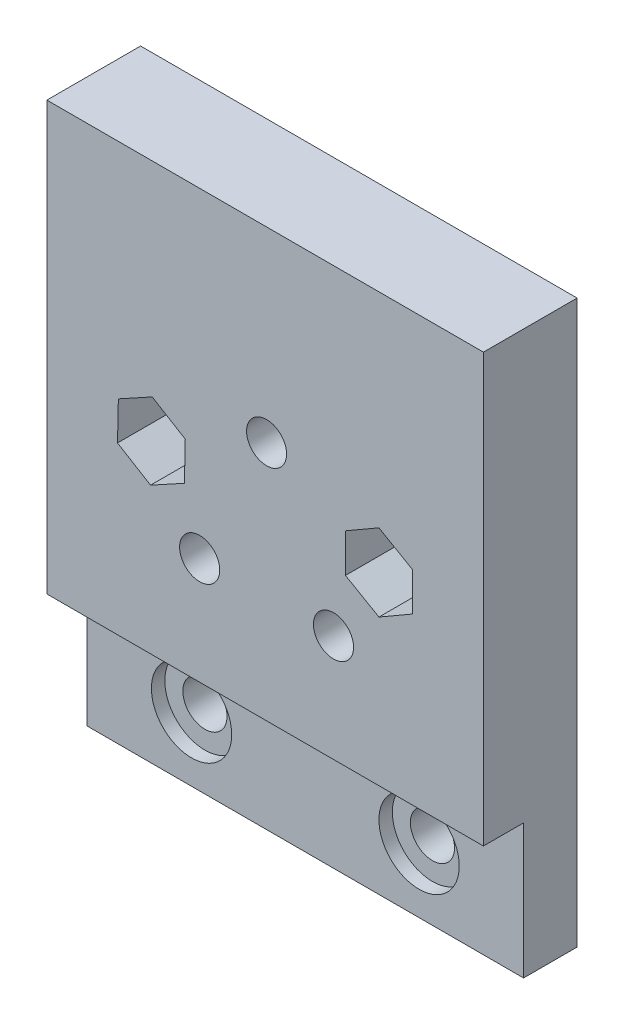
ISO-10303-21;
HEADER;
FILE_DESCRIPTION(('STEP AP214'),'2;1');
FILE_NAME('part.step','',(''),(''),'','','');
FILE_SCHEMA(('AUTOMOTIVE_DESIGN { 1 0 10303 214 1 1 1 1 }'));
ENDSEC;
DATA;
#1=APPLICATION_CONTEXT('core data for automotive mechanical design processes');
#2=APPLICATION_PROTOCOL_DEFINITION('international standard','automotive_design',2000,#1);
#3=PRODUCT_CONTEXT('',#1,'mechanical');
#4=PRODUCT('Part','Part','',(#3));
#5=PRODUCT_RELATED_PRODUCT_CATEGORY('part','',(#4));
#6=PRODUCT_DEFINITION_FORMATION('','',#4);
#7=PRODUCT_DEFINITION_CONTEXT('part definition',#1,'design');
#8=PRODUCT_DEFINITION('design','',#6,#7);
#9=PRODUCT_DEFINITION_SHAPE('','',#8);
#10=(LENGTH_UNIT() NAMED_UNIT(*) SI_UNIT(.MILLI.,.METRE.));
#11=(NAMED_UNIT(*) PLANE_ANGLE_UNIT() SI_UNIT($,.RADIAN.));
#12=(NAMED_UNIT(*) SI_UNIT($,.STERADIAN.) SOLID_ANGLE_UNIT());
#13=UNCERTAINTY_MEASURE_WITH_UNIT(LENGTH_MEASURE(1.E-05),#10,'distance_accuracy_value','');
#14=(GEOMETRIC_REPRESENTATION_CONTEXT(3) GLOBAL_UNCERTAINTY_ASSIGNED_CONTEXT((#13)) GLOBAL_UNIT_ASSIGNED_CONTEXT((#10,
#11,#12)) REPRESENTATION_CONTEXT('',''));
#15=CARTESIAN_POINT('',(0.,0.,0.));
#16=DIRECTION('',(0.,0.,1.));
#17=DIRECTION('',(1.,0.,0.));
#18=AXIS2_PLACEMENT_3D('',#15,#16,#17);
#19=CARTESIAN_POINT('',(0.107090409100055,13.7016999955428,-4.24264068711929));
#20=DIRECTION('',(0.,0.,1.));
#21=DIRECTION('',(1.,0.,0.));
#22=AXIS2_PLACEMENT_3D('',#19,#20,#21);
#23=CYLINDRICAL_SURFACE('',#22,1.49545472646863);
#24=CARTESIAN_POINT('',(0.107090409100055,13.7016999955428,7.));
#25=DIRECTION('',(0.,0.,1.));
#26=DIRECTION('',(1.,0.,0.));
#27=AXIS2_PLACEMENT_3D('',#24,#25,#26);
#28=CIRCLE('',#27,1.49545472646863);
#29=CARTESIAN_POINT('',(1.60254513556868,13.7016999955428,7.));
#30=VERTEX_POINT('',#29);
#31=EDGE_CURVE('E248',#30,#30,#28,.T.);
#32=ORIENTED_EDGE('',*,*,#31,.T.);
#33=EDGE_LOOP('',(#32));
#34=FACE_BOUND('',#33,.T.);
#35=CARTESIAN_POINT('',(0.107090409100055,13.7016999955428,4.));
#36=DIRECTION('',(0.,0.,-1.));
#37=DIRECTION('',(-1.,0.,0.));
#38=AXIS2_PLACEMENT_3D('',#35,#36,#37);
#39=CIRCLE('',#38,1.49545472646863);
#40=CARTESIAN_POINT('',(-1.38836431736857,13.7016999955428,4.));
#41=VERTEX_POINT('',#40);
#42=EDGE_CURVE('E37',#41,#41,#39,.F.);
#43=ORIENTED_EDGE('',*,*,#42,.F.);
#44=EDGE_LOOP('',(#43));
#45=FACE_BOUND('',#44,.T.);
#46=ADVANCED_FACE('F33',(#34,#45),#23,.F.);
#47=CARTESIAN_POINT('',(-4.89290959089994,3.70169999554279,-4.24264068711929));
#48=DIRECTION('',(0.,0.,1.));
#49=DIRECTION('',(1.,0.,0.));
#50=AXIS2_PLACEMENT_3D('',#47,#48,#49);
#51=CYLINDRICAL_SURFACE('',#50,1.5);
#52=CARTESIAN_POINT('',(-4.89290959089994,3.70169999554279,7.));
#53=DIRECTION('',(0.,0.,1.));
#54=DIRECTION('',(1.,0.,0.));
#55=AXIS2_PLACEMENT_3D('',#52,#53,#54);
#56=CIRCLE('',#55,1.5);
#57=CARTESIAN_POINT('',(-3.39290959089994,3.70169999554279,7.));
#58=VERTEX_POINT('',#57);
#59=EDGE_CURVE('E252',#58,#58,#56,.T.);
#60=ORIENTED_EDGE('',*,*,#59,.T.);
#61=EDGE_LOOP('',(#60));
#62=FACE_BOUND('',#61,.T.);
#63=CARTESIAN_POINT('',(-4.89290959089994,3.70169999554279,4.));
#64=DIRECTION('',(0.,0.,-1.));
#65=DIRECTION('',(-1.,0.,0.));
#66=AXIS2_PLACEMENT_3D('',#63,#64,#65);
#67=CIRCLE('',#66,1.5);
#68=CARTESIAN_POINT('',(-6.39290959089994,3.70169999554279,4.));
#69=VERTEX_POINT('',#68);
#70=EDGE_CURVE('E242',#69,#69,#67,.F.);
#71=ORIENTED_EDGE('',*,*,#70,.F.);
#72=EDGE_LOOP('',(#71));
#73=FACE_BOUND('',#72,.T.);
#74=ADVANCED_FACE('F399',(#62,#73),#51,.F.);
#75=CARTESIAN_POINT('',(5.10709040910006,3.70169999554279,-4.24264068711929));
#76=DIRECTION('',(0.,0.,1.));
#77=DIRECTION('',(1.,0.,0.));
#78=AXIS2_PLACEMENT_3D('',#75,#76,#77);
#79=CYLINDRICAL_SURFACE('',#78,1.5);
#80=CARTESIAN_POINT('',(5.10709040910006,3.70169999554279,7.));
#81=DIRECTION('',(0.,0.,1.));
#82=DIRECTION('',(1.,0.,0.));
#83=AXIS2_PLACEMENT_3D('',#80,#81,#82);
#84=CIRCLE('',#83,1.5);
#85=CARTESIAN_POINT('',(6.60709040910006,3.70169999554279,7.));
#86=VERTEX_POINT('',#85);
#87=EDGE_CURVE('E257',#86,#86,#84,.T.);
#88=ORIENTED_EDGE('',*,*,#87,.T.);
#89=EDGE_LOOP('',(#88));
#90=FACE_BOUND('',#89,.T.);
#91=CARTESIAN_POINT('',(5.10709040910006,3.70169999554279,4.));
#92=DIRECTION('',(0.,0.,-1.));
#93=DIRECTION('',(-1.,0.,0.));
#94=AXIS2_PLACEMENT_3D('',#91,#92,#93);
#95=CIRCLE('',#94,1.5);
#96=CARTESIAN_POINT('',(3.60709040910006,3.70169999554279,4.));
#97=VERTEX_POINT('',#96);
#98=EDGE_CURVE('E240',#97,#97,#95,.F.);
#99=ORIENTED_EDGE('',*,*,#98,.F.);
#100=EDGE_LOOP('',(#99));
#101=FACE_BOUND('',#100,.T.);
#102=ADVANCED_FACE('F404',(#90,#101),#79,.F.);
#103=CARTESIAN_POINT('',(8.50000030762313,-9.49999998669471,4.));
#104=DIRECTION('',(0.,0.,-1.));
#105=DIRECTION('',(-1.,0.,0.));
#106=AXIS2_PLACEMENT_3D('',#103,#104,#105);
#107=CYLINDRICAL_SURFACE('',#106,1.6499998258421);
#108=CARTESIAN_POINT('',(8.50000030762313,-9.49999998669471,0.));
#109=DIRECTION('',(0.,0.,1.));
#110=DIRECTION('',(1.,0.,0.));
#111=AXIS2_PLACEMENT_3D('',#108,#109,#110);
#112=CIRCLE('',#111,1.6499998258421);
#113=CARTESIAN_POINT('',(10.1500001334652,-9.49999998669471,0.));
#114=VERTEX_POINT('',#113);
#115=EDGE_CURVE('E200',#114,#114,#112,.T.);
#116=ORIENTED_EDGE('',*,*,#115,.F.);
#117=EDGE_LOOP('',(#116));
#118=FACE_BOUND('',#117,.T.);
#119=CARTESIAN_POINT('',(8.50000030762313,-9.49999998669471,3.));
#120=DIRECTION('',(0.,0.,1.));
#121=DIRECTION('',(1.,0.,0.));
#122=AXIS2_PLACEMENT_3D('',#119,#120,#121);
#123=CIRCLE('',#122,1.6499998258421);
#124=CARTESIAN_POINT('',(10.1500001334652,-9.49999998669471,3.));
#125=VERTEX_POINT('',#124);
#126=EDGE_CURVE('E236',#125,#125,#123,.T.);
#127=ORIENTED_EDGE('',*,*,#126,.T.);
#128=EDGE_LOOP('',(#127));
#129=FACE_BOUND('',#128,.T.);
#130=ADVANCED_FACE('F560',(#118,#129),#107,.F.);
#131=CARTESIAN_POINT('',(-8.49999953672026,-9.50000042645932,4.));
#132=DIRECTION('',(0.,0.,-1.));
#133=DIRECTION('',(-1.,0.,0.));
#134=AXIS2_PLACEMENT_3D('',#131,#132,#133);
#135=CYLINDRICAL_SURFACE('',#134,1.65000012235009);
#136=CARTESIAN_POINT('',(-8.49999953672026,-9.50000042645932,0.));
#137=DIRECTION('',(0.,0.,1.));
#138=DIRECTION('',(1.,0.,0.));
#139=AXIS2_PLACEMENT_3D('',#136,#137,#138);
#140=CIRCLE('',#139,1.65000012235009);
#141=CARTESIAN_POINT('',(-6.84999941437017,-9.50000042645932,0.));
#142=VERTEX_POINT('',#141);
#143=EDGE_CURVE('E197',#142,#142,#140,.T.);
#144=ORIENTED_EDGE('',*,*,#143,.F.);
#145=EDGE_LOOP('',(#144));
#146=FACE_BOUND('',#145,.T.);
#147=CARTESIAN_POINT('',(-8.49999953672026,-9.50000042645932,3.));
#148=DIRECTION('',(0.,0.,1.));
#149=DIRECTION('',(1.,0.,0.));
#150=AXIS2_PLACEMENT_3D('',#147,#148,#149);
#151=CIRCLE('',#150,1.65000012235009);
#152=CARTESIAN_POINT('',(-6.84999941437017,-9.50000042645932,3.));
#153=VERTEX_POINT('',#152);
#154=EDGE_CURVE('E233',#153,#153,#151,.T.);
#155=ORIENTED_EDGE('',*,*,#154,.T.);
#156=EDGE_LOOP('',(#155));
#157=FACE_BOUND('',#156,.T.);
#158=ADVANCED_FACE('F576',(#146,#157),#135,.F.);
#159=CARTESIAN_POINT('',(-8.49999960982778,9.50000004647099,4.));
#160=DIRECTION('',(0.,0.,-1.));
#161=DIRECTION('',(-1.,0.,0.));
#162=AXIS2_PLACEMENT_3D('',#159,#160,#161);
#163=CYLINDRICAL_SURFACE('',#162,1.6499997527677);
#164=CARTESIAN_POINT('',(-8.49999960982778,9.50000004647099,0.));
#165=DIRECTION('',(0.,0.,1.));
#166=DIRECTION('',(1.,0.,0.));
#167=AXIS2_PLACEMENT_3D('',#164,#165,#166);
#168=CIRCLE('',#167,1.6499997527677);
#169=CARTESIAN_POINT('',(-6.84999985706007,9.50000004647099,0.));
#170=VERTEX_POINT('',#169);
#171=EDGE_CURVE('E207',#170,#170,#168,.T.);
#172=ORIENTED_EDGE('',*,*,#171,.F.);
#173=EDGE_LOOP('',(#172));
#174=FACE_BOUND('',#173,.T.);
#175=CARTESIAN_POINT('',(-8.49999960982778,9.50000004647099,2.));
#176=DIRECTION('',(0.,0.,1.));
#177=DIRECTION('',(1.,0.,0.));
#178=AXIS2_PLACEMENT_3D('',#175,#176,#177);
#179=CIRCLE('',#178,1.6499997527677);
#180=CARTESIAN_POINT('',(-6.84999985706007,9.50000004647099,2.));
#181=VERTEX_POINT('',#180);
#182=EDGE_CURVE('E280',#181,#181,#179,.T.);
#183=ORIENTED_EDGE('',*,*,#182,.T.);
#184=EDGE_LOOP('',(#183));
#185=FACE_BOUND('',#184,.T.);
#186=ADVANCED_FACE('F584',(#174,#185),#163,.F.);
#187=CARTESIAN_POINT('',(8.49999986629428,9.50000038974656,4.));
#188=DIRECTION('',(0.,0.,-1.));
#189=DIRECTION('',(-1.,0.,0.));
#190=AXIS2_PLACEMENT_3D('',#187,#188,#189);
#191=CYLINDRICAL_SURFACE('',#190,1.64999997923242);
#192=CARTESIAN_POINT('',(8.49999986629428,9.50000038974656,0.));
#193=DIRECTION('',(0.,0.,1.));
#194=DIRECTION('',(1.,0.,0.));
#195=AXIS2_PLACEMENT_3D('',#192,#193,#194);
#196=CIRCLE('',#195,1.64999997923242);
#197=CARTESIAN_POINT('',(10.1499998455267,9.50000038974656,0.));
#198=VERTEX_POINT('',#197);
#199=EDGE_CURVE('E204',#198,#198,#196,.T.);
#200=ORIENTED_EDGE('',*,*,#199,.F.);
#201=EDGE_LOOP('',(#200));
#202=FACE_BOUND('',#201,.T.);
#203=CARTESIAN_POINT('',(8.49999986629428,9.50000038974656,2.));
#204=DIRECTION('',(0.,0.,1.));
#205=DIRECTION('',(1.,0.,0.));
#206=AXIS2_PLACEMENT_3D('',#203,#204,#205);
#207=CIRCLE('',#206,1.64999997923242);
#208=CARTESIAN_POINT('',(10.1499998455267,9.50000038974656,2.));
#209=VERTEX_POINT('',#208);
#210=EDGE_CURVE('E166',#209,#209,#207,.T.);
#211=ORIENTED_EDGE('',*,*,#210,.T.);
#212=EDGE_LOOP('',(#211));
#213=FACE_BOUND('',#212,.T.);
#214=ADVANCED_FACE('F593',(#202,#213),#191,.F.);
#215=CARTESIAN_POINT('',(0.,0.,4.));
#216=DIRECTION('',(0.,0.,1.));
#217=DIRECTION('',(1.,0.,0.));
#218=AXIS2_PLACEMENT_3D('',#215,#216,#217);
#219=PLANE('',#218);
#220=CARTESIAN_POINT('',(8.50000030762313,-9.49999998669471,4.));
#221=DIRECTION('',(0.,0.,1.));
#222=DIRECTION('',(1.,0.,0.));
#223=AXIS2_PLACEMENT_3D('',#220,#221,#222);
#224=CIRCLE('',#223,3.);
#225=CARTESIAN_POINT('',(11.5000003076231,-9.49999998669471,4.));
#226=VERTEX_POINT('',#225);
#227=EDGE_CURVE('E263',#226,#226,#224,.T.);
#228=ORIENTED_EDGE('',*,*,#227,.F.);
#229=EDGE_LOOP('',(#228));
#230=FACE_BOUND('',#229,.T.);
#231=CARTESIAN_POINT('',(-8.49999953672026,-9.50000042645932,4.));
#232=DIRECTION('',(0.,0.,1.));
#233=DIRECTION('',(1.,0.,0.));
#234=AXIS2_PLACEMENT_3D('',#231,#232,#233);
#235=CIRCLE('',#234,3.);
#236=CARTESIAN_POINT('',(-5.49999953672026,-9.50000042645932,4.));
#237=VERTEX_POINT('',#236);
#238=EDGE_CURVE('E269',#237,#237,#235,.T.);
#239=ORIENTED_EDGE('',*,*,#238,.F.);
#240=EDGE_LOOP('',(#239));
#241=FACE_BOUND('',#240,.T.);
#242=DIRECTION('',(1.,0.,0.));
#243=VECTOR('',#242,1.);
#244=CARTESIAN_POINT('',(-16.3070904091001,-4.29830000445721,4.));
#245=LINE('',#244,#243);
#246=CARTESIAN_POINT('',(-16.3070904091001,-4.29830000445721,4.));
#247=VERTEX_POINT('',#246);
#248=CARTESIAN_POINT('',(16.3070904091001,-4.29830000445721,4.));
#249=VERTEX_POINT('',#248);
#250=EDGE_CURVE('E327',#247,#249,#245,.T.);
#251=ORIENTED_EDGE('',*,*,#250,.F.);
#252=DIRECTION('',(0.,-1.,0.));
#253=VECTOR('',#252,1.);
#254=CARTESIAN_POINT('',(-16.3070904091001,27.657590055119,4.));
#255=LINE('',#254,#253);
#256=CARTESIAN_POINT('',(-16.3070904091001,-14.33798763901,4.));
#257=VERTEX_POINT('',#256);
#258=EDGE_CURVE('E213',#247,#257,#255,.T.);
#259=ORIENTED_EDGE('',*,*,#258,.T.);
#260=DIRECTION('',(1.,0.,0.));
#261=VECTOR('',#260,1.);
#262=CARTESIAN_POINT('',(-16.3070904091001,-14.33798763901,4.));
#263=LINE('',#262,#261);
#264=CARTESIAN_POINT('',(16.3070904091001,-14.33798763901,4.));
#265=VERTEX_POINT('',#264);
#266=EDGE_CURVE('E216',#257,#265,#263,.T.);
#267=ORIENTED_EDGE('',*,*,#266,.T.);
#268=DIRECTION('',(0.,1.,0.));
#269=VECTOR('',#268,1.);
#270=CARTESIAN_POINT('',(16.3070904091001,27.657590055119,4.));
#271=LINE('',#270,#269);
#272=EDGE_CURVE('E211',#265,#249,#271,.T.);
#273=ORIENTED_EDGE('',*,*,#272,.T.);
#274=EDGE_LOOP('',(#251,#259,#267,#273));
#275=FACE_BOUND('',#274,.T.);
#276=ADVANCED_FACE('F600',(#230,#241,#275),#219,.T.);
#277=CARTESIAN_POINT('',(0.,0.,0.));
#278=DIRECTION('',(0.,0.,1.));
#279=DIRECTION('',(1.,0.,0.));
#280=AXIS2_PLACEMENT_3D('',#277,#278,#279);
#281=PLANE('',#280);
#282=CARTESIAN_POINT('',(0.107090409100053,13.7016999955428,0.));
#283=DIRECTION('',(0.,0.,-1.));
#284=DIRECTION('',(-1.,0.,0.));
#285=AXIS2_PLACEMENT_3D('',#282,#283,#284);
#286=CIRCLE('',#285,3.25);
#287=CARTESIAN_POINT('',(-3.14290959089995,13.7016999955428,0.));
#288=VERTEX_POINT('',#287);
#289=EDGE_CURVE('E842',#288,#288,#286,.T.);
#290=ORIENTED_EDGE('',*,*,#289,.F.);
#291=EDGE_LOOP('',(#290));
#292=FACE_BOUND('',#291,.T.);
#293=CARTESIAN_POINT('',(5.10709040910006,3.70169999554279,0.));
#294=DIRECTION('',(0.,0.,-1.));
#295=DIRECTION('',(-1.,0.,0.));
#296=AXIS2_PLACEMENT_3D('',#293,#294,#295);
#297=CIRCLE('',#296,3.25);
#298=CARTESIAN_POINT('',(1.85709040910006,3.70169999554279,0.));
#299=VERTEX_POINT('',#298);
#300=EDGE_CURVE('E846',#299,#299,#297,.T.);
#301=ORIENTED_EDGE('',*,*,#300,.F.);
#302=EDGE_LOOP('',(#301));
#303=FACE_BOUND('',#302,.T.);
#304=CARTESIAN_POINT('',(-4.89290959089994,3.70169999554279,0.));
#305=DIRECTION('',(0.,0.,-1.));
#306=DIRECTION('',(-1.,0.,0.));
#307=AXIS2_PLACEMENT_3D('',#304,#305,#306);
#308=CIRCLE('',#307,3.25);
#309=CARTESIAN_POINT('',(-8.14290959089994,3.70169999554279,0.));
#310=VERTEX_POINT('',#309);
#311=EDGE_CURVE('E849',#310,#310,#308,.T.);
#312=ORIENTED_EDGE('',*,*,#311,.F.);
#313=EDGE_LOOP('',(#312));
#314=FACE_BOUND('',#313,.T.);
#315=DIRECTION('',(0.,1.,0.));
#316=VECTOR('',#315,1.);
#317=CARTESIAN_POINT('',(16.3070904091001,27.657590055119,0.));
#318=LINE('',#317,#316);
#319=CARTESIAN_POINT('',(16.3070904091001,-14.33798763901,0.));
#320=VERTEX_POINT('',#319);
#321=CARTESIAN_POINT('',(16.3070904091001,27.657590055119,0.));
#322=VERTEX_POINT('',#321);
#323=EDGE_CURVE('E210',#320,#322,#318,.T.);
#324=ORIENTED_EDGE('',*,*,#323,.F.);
#325=DIRECTION('',(1.,0.,0.));
#326=VECTOR('',#325,1.);
#327=CARTESIAN_POINT('',(-16.3070904091001,-14.33798763901,0.));
#328=LINE('',#327,#326);
#329=CARTESIAN_POINT('',(-16.3070904091001,-14.33798763901,0.));
#330=VERTEX_POINT('',#329);
#331=EDGE_CURVE('E214',#330,#320,#328,.T.);
#332=ORIENTED_EDGE('',*,*,#331,.F.);
#333=DIRECTION('',(0.,-1.,0.));
#334=VECTOR('',#333,1.);
#335=CARTESIAN_POINT('',(-16.3070904091001,27.657590055119,0.));
#336=LINE('',#335,#334);
#337=CARTESIAN_POINT('',(-16.3070904091001,27.657590055119,0.));
#338=VERTEX_POINT('',#337);
#339=EDGE_CURVE('E223',#338,#330,#336,.T.);
#340=ORIENTED_EDGE('',*,*,#339,.F.);
#341=DIRECTION('',(-1.,0.,0.));
#342=VECTOR('',#341,1.);
#343=CARTESIAN_POINT('',(-16.3070904091001,27.657590055119,0.));
#344=LINE('',#343,#342);
#345=EDGE_CURVE('E221',#322,#338,#344,.T.);
#346=ORIENTED_EDGE('',*,*,#345,.F.);
#347=EDGE_LOOP('',(#324,#332,#340,#346));
#348=FACE_BOUND('',#347,.T.);
#349=ORIENTED_EDGE('',*,*,#171,.T.);
#350=EDGE_LOOP('',(#349));
#351=FACE_BOUND('',#350,.T.);
#352=ORIENTED_EDGE('',*,*,#199,.T.);
#353=EDGE_LOOP('',(#352));
#354=FACE_BOUND('',#353,.T.);
#355=ORIENTED_EDGE('',*,*,#115,.T.);
#356=EDGE_LOOP('',(#355));
#357=FACE_BOUND('',#356,.T.);
#358=ORIENTED_EDGE('',*,*,#143,.T.);
#359=EDGE_LOOP('',(#358));
#360=FACE_BOUND('',#359,.T.);
#361=ADVANCED_FACE('F754',(#292,#303,#314,#348,#351,#354,#357,#360),#281,.F.);
#362=CARTESIAN_POINT('',(16.3070904091001,27.657590055119,4.));
#363=DIRECTION('',(-1.,0.,0.));
#364=DIRECTION('',(0.,0.,1.));
#365=AXIS2_PLACEMENT_3D('',#362,#363,#364);
#366=PLANE('',#365);
#367=ORIENTED_EDGE('',*,*,#323,.T.);
#368=DIRECTION('',(0.,0.,-1.));
#369=VECTOR('',#368,1.);
#370=CARTESIAN_POINT('',(16.3070904091001,27.657590055119,4.));
#371=LINE('',#370,#369);
#372=CARTESIAN_POINT('',(16.3070904091001,27.657590055119,7.));
#373=VERTEX_POINT('',#372);
#374=EDGE_CURVE('E11',#373,#322,#371,.T.);
#375=ORIENTED_EDGE('',*,*,#374,.F.);
#376=DIRECTION('',(0.,1.,0.));
#377=VECTOR('',#376,1.);
#378=CARTESIAN_POINT('',(16.3070904091001,27.657590055119,7.));
#379=LINE('',#378,#377);
#380=CARTESIAN_POINT('',(16.3070904091001,-4.29830000445721,7.));
#381=VERTEX_POINT('',#380);
#382=EDGE_CURVE('E333',#381,#373,#379,.T.);
#383=ORIENTED_EDGE('',*,*,#382,.F.);
#384=DIRECTION('',(0.,0.,-1.));
#385=VECTOR('',#384,1.);
#386=CARTESIAN_POINT('',(16.3070904091001,-4.29830000445721,7.));
#387=LINE('',#386,#385);
#388=EDGE_CURVE('E339',#381,#249,#387,.T.);
#389=ORIENTED_EDGE('',*,*,#388,.T.);
#390=ORIENTED_EDGE('',*,*,#272,.F.);
#391=DIRECTION('',(0.,0.,-1.));
#392=VECTOR('',#391,1.);
#393=CARTESIAN_POINT('',(16.3070904091001,-14.33798763901,4.));
#394=LINE('',#393,#392);
#395=EDGE_CURVE('E218',#265,#320,#394,.T.);
#396=ORIENTED_EDGE('',*,*,#395,.T.);
#397=EDGE_LOOP('',(#367,#375,#383,#389,#390,#396));
#398=FACE_BOUND('',#397,.T.);
#399=ADVANCED_FACE('F35',(#398),#366,.F.);
#400=CARTESIAN_POINT('',(-16.3070904091001,27.657590055119,4.));
#401=DIRECTION('',(0.,-1.,0.));
#402=DIRECTION('',(0.,0.,-1.));
#403=AXIS2_PLACEMENT_3D('',#400,#401,#402);
#404=PLANE('',#403);
#405=ORIENTED_EDGE('',*,*,#345,.T.);
#406=DIRECTION('',(0.,0.,-1.));
#407=VECTOR('',#406,1.);
#408=CARTESIAN_POINT('',(-16.3070904091001,27.657590055119,4.));
#409=LINE('',#408,#407);
#410=CARTESIAN_POINT('',(-16.3070904091001,27.657590055119,7.));
#411=VERTEX_POINT('',#410);
#412=EDGE_CURVE('E42',#411,#338,#409,.T.);
#413=ORIENTED_EDGE('',*,*,#412,.F.);
#414=DIRECTION('',(-1.,0.,0.));
#415=VECTOR('',#414,1.);
#416=CARTESIAN_POINT('',(-16.3070904091001,27.657590055119,7.));
#417=LINE('',#416,#415);
#418=EDGE_CURVE('E336',#373,#411,#417,.T.);
#419=ORIENTED_EDGE('',*,*,#418,.F.);
#420=ORIENTED_EDGE('',*,*,#374,.T.);
#421=EDGE_LOOP('',(#405,#413,#419,#420));
#422=FACE_BOUND('',#421,.T.);
#423=ADVANCED_FACE('F734',(#422),#404,.F.);
#424=CARTESIAN_POINT('',(-16.3070904091001,27.657590055119,4.));
#425=DIRECTION('',(1.,0.,0.));
#426=DIRECTION('',(0.,0.,-1.));
#427=AXIS2_PLACEMENT_3D('',#424,#425,#426);
#428=PLANE('',#427);
#429=ORIENTED_EDGE('',*,*,#339,.T.);
#430=DIRECTION('',(0.,0.,-1.));
#431=VECTOR('',#430,1.);
#432=CARTESIAN_POINT('',(-16.3070904091001,-14.33798763901,4.));
#433=LINE('',#432,#431);
#434=EDGE_CURVE('E228',#257,#330,#433,.T.);
#435=ORIENTED_EDGE('',*,*,#434,.F.);
#436=ORIENTED_EDGE('',*,*,#258,.F.);
#437=DIRECTION('',(0.,0.,-1.));
#438=VECTOR('',#437,1.);
#439=CARTESIAN_POINT('',(-16.3070904091001,-4.29830000445721,7.));
#440=LINE('',#439,#438);
#441=CARTESIAN_POINT('',(-16.3070904091001,-4.29830000445721,7.));
#442=VERTEX_POINT('',#441);
#443=EDGE_CURVE('E196',#442,#247,#440,.T.);
#444=ORIENTED_EDGE('',*,*,#443,.F.);
#445=DIRECTION('',(0.,-1.,0.));
#446=VECTOR('',#445,1.);
#447=CARTESIAN_POINT('',(-16.3070904091001,27.657590055119,7.));
#448=LINE('',#447,#446);
#449=EDGE_CURVE('E328',#411,#442,#448,.T.);
#450=ORIENTED_EDGE('',*,*,#449,.F.);
#451=ORIENTED_EDGE('',*,*,#412,.T.);
#452=EDGE_LOOP('',(#429,#435,#436,#444,#450,#451));
#453=FACE_BOUND('',#452,.T.);
#454=ADVANCED_FACE('F728',(#453),#428,.F.);
#455=CARTESIAN_POINT('',(-16.3070904091001,-14.33798763901,4.));
#456=DIRECTION('',(0.,1.,0.));
#457=DIRECTION('',(0.,0.,1.));
#458=AXIS2_PLACEMENT_3D('',#455,#456,#457);
#459=PLANE('',#458);
#460=ORIENTED_EDGE('',*,*,#331,.T.);
#461=ORIENTED_EDGE('',*,*,#395,.F.);
#462=ORIENTED_EDGE('',*,*,#266,.F.);
#463=ORIENTED_EDGE('',*,*,#434,.T.);
#464=EDGE_LOOP('',(#460,#461,#462,#463));
#465=FACE_BOUND('',#464,.T.);
#466=ADVANCED_FACE('F723',(#465),#459,.F.);
#467=CARTESIAN_POINT('',(10.9999998662943,10.9433760627206,1.));
#468=DIRECTION('',(0.5,0.866025403784439,0.));
#469=DIRECTION('',(-0.866025403784439,0.5,0.));
#470=AXIS2_PLACEMENT_3D('',#467,#468,#469);
#471=PLANE('',#470);
#472=DIRECTION('',(0.,0.,1.));
#473=VECTOR('',#472,1.);
#474=CARTESIAN_POINT('',(8.49999986629428,12.3867517356947,1.));
#475=LINE('',#474,#473);
#476=CARTESIAN_POINT('',(8.49999986629428,12.3867517356947,2.));
#477=VERTEX_POINT('',#476);
#478=CARTESIAN_POINT('',(8.49999986629428,12.3867517356947,7.));
#479=VERTEX_POINT('',#478);
#480=EDGE_CURVE('E174',#477,#479,#475,.T.);
#481=ORIENTED_EDGE('',*,*,#480,.F.);
#482=DIRECTION('',(-0.866025403784438,0.5,0.));
#483=VECTOR('',#482,1.);
#484=CARTESIAN_POINT('',(10.9999998662943,10.9433760627206,2.));
#485=LINE('',#484,#483);
#486=CARTESIAN_POINT('',(10.9999998662943,10.9433760627206,2.));
#487=VERTEX_POINT('',#486);
#488=EDGE_CURVE('E50',#487,#477,#485,.T.);
#489=ORIENTED_EDGE('',*,*,#488,.F.);
#490=DIRECTION('',(0.,0.,1.));
#491=VECTOR('',#490,1.);
#492=CARTESIAN_POINT('',(10.9999998662943,10.9433760627206,1.));
#493=LINE('',#492,#491);
#494=CARTESIAN_POINT('',(10.9999998662943,10.9433760627206,7.));
#495=VERTEX_POINT('',#494);
#496=EDGE_CURVE('E172',#487,#495,#493,.T.);
#497=ORIENTED_EDGE('',*,*,#496,.T.);
#498=DIRECTION('',(-0.866025403784438,0.5,0.));
#499=VECTOR('',#498,1.);
#500=CARTESIAN_POINT('',(10.9999998662943,10.9433760627206,7.));
#501=LINE('',#500,#499);
#502=EDGE_CURVE('E295',#495,#479,#501,.T.);
#503=ORIENTED_EDGE('',*,*,#502,.T.);
#504=EDGE_LOOP('',(#481,#489,#497,#503));
#505=FACE_BOUND('',#504,.T.);
#506=ADVANCED_FACE('F170',(#505),#471,.F.);
#507=CARTESIAN_POINT('',(10.9999998662943,8.0566247167725,1.));
#508=DIRECTION('',(1.,0.,0.));
#509=DIRECTION('',(0.,0.,-1.));
#510=AXIS2_PLACEMENT_3D('',#507,#508,#509);
#511=PLANE('',#510);
#512=ORIENTED_EDGE('',*,*,#496,.F.);
#513=DIRECTION('',(0.,1.,0.));
#514=VECTOR('',#513,1.);
#515=CARTESIAN_POINT('',(10.9999998662943,8.0566247167725,2.));
#516=LINE('',#515,#514);
#517=CARTESIAN_POINT('',(10.9999998662943,8.0566247167725,2.));
#518=VERTEX_POINT('',#517);
#519=EDGE_CURVE('E158',#518,#487,#516,.T.);
#520=ORIENTED_EDGE('',*,*,#519,.F.);
#521=DIRECTION('',(0.,0.,1.));
#522=VECTOR('',#521,1.);
#523=CARTESIAN_POINT('',(10.9999998662943,8.0566247167725,1.));
#524=LINE('',#523,#522);
#525=CARTESIAN_POINT('',(10.9999998662943,8.0566247167725,7.));
#526=VERTEX_POINT('',#525);
#527=EDGE_CURVE('E182',#518,#526,#524,.T.);
#528=ORIENTED_EDGE('',*,*,#527,.T.);
#529=DIRECTION('',(0.,1.,0.));
#530=VECTOR('',#529,1.);
#531=CARTESIAN_POINT('',(10.9999998662943,8.0566247167725,7.));
#532=LINE('',#531,#530);
#533=EDGE_CURVE('E179',#526,#495,#532,.T.);
#534=ORIENTED_EDGE('',*,*,#533,.T.);
#535=EDGE_LOOP('',(#512,#520,#528,#534));
#536=FACE_BOUND('',#535,.T.);
#537=ADVANCED_FACE('F177',(#536),#511,.F.);
#538=CARTESIAN_POINT('',(8.49999986629428,6.61324904379843,1.));
#539=DIRECTION('',(0.500000000000001,-0.866025403784438,0.));
#540=DIRECTION('',(0.866025403784438,0.500000000000001,0.));
#541=AXIS2_PLACEMENT_3D('',#538,#539,#540);
#542=PLANE('',#541);
#543=ORIENTED_EDGE('',*,*,#527,.F.);
#544=DIRECTION('',(0.866025403784438,0.5,0.));
#545=VECTOR('',#544,1.);
#546=CARTESIAN_POINT('',(8.49999986629428,6.61324904379843,2.));
#547=LINE('',#546,#545);
#548=CARTESIAN_POINT('',(8.49999986629428,6.61324904379843,2.));
#549=VERTEX_POINT('',#548);
#550=EDGE_CURVE('E162',#549,#518,#547,.T.);
#551=ORIENTED_EDGE('',*,*,#550,.F.);
#552=DIRECTION('',(0.,0.,1.));
#553=VECTOR('',#552,1.);
#554=CARTESIAN_POINT('',(8.49999986629428,6.61324904379843,1.));
#555=LINE('',#554,#553);
#556=CARTESIAN_POINT('',(8.49999986629428,6.61324904379843,7.));
#557=VERTEX_POINT('',#556);
#558=EDGE_CURVE('E186',#549,#557,#555,.T.);
#559=ORIENTED_EDGE('',*,*,#558,.T.);
#560=DIRECTION('',(0.866025403784438,0.5,0.));
#561=VECTOR('',#560,1.);
#562=CARTESIAN_POINT('',(8.49999986629428,6.61324904379843,7.));
#563=LINE('',#562,#561);
#564=EDGE_CURVE('E306',#557,#526,#563,.T.);
#565=ORIENTED_EDGE('',*,*,#564,.T.);
#566=EDGE_LOOP('',(#543,#551,#559,#565));
#567=FACE_BOUND('',#566,.T.);
#568=ADVANCED_FACE('F693',(#567),#542,.F.);
#569=CARTESIAN_POINT('',(5.99999986629428,8.0566247167725,1.));
#570=DIRECTION('',(-0.5,-0.866025403784439,0.));
#571=DIRECTION('',(0.866025403784439,-0.5,0.));
#572=AXIS2_PLACEMENT_3D('',#569,#570,#571);
#573=PLANE('',#572);
#574=ORIENTED_EDGE('',*,*,#558,.F.);
#575=DIRECTION('',(0.866025403784439,-0.5,0.));
#576=VECTOR('',#575,1.);
#577=CARTESIAN_POINT('',(5.99999986629428,8.0566247167725,2.));
#578=LINE('',#577,#576);
#579=CARTESIAN_POINT('',(5.99999986629428,8.0566247167725,2.));
#580=VERTEX_POINT('',#579);
#581=EDGE_CURVE('E277',#580,#549,#578,.T.);
#582=ORIENTED_EDGE('',*,*,#581,.F.);
#583=DIRECTION('',(0.,0.,1.));
#584=VECTOR('',#583,1.);
#585=CARTESIAN_POINT('',(5.99999986629428,8.0566247167725,1.));
#586=LINE('',#585,#584);
#587=CARTESIAN_POINT('',(5.99999986629428,8.0566247167725,7.));
#588=VERTEX_POINT('',#587);
#589=EDGE_CURVE('E191',#580,#588,#586,.T.);
#590=ORIENTED_EDGE('',*,*,#589,.T.);
#591=DIRECTION('',(0.866025403784439,-0.5,0.));
#592=VECTOR('',#591,1.);
#593=CARTESIAN_POINT('',(5.99999986629428,8.0566247167725,7.));
#594=LINE('',#593,#592);
#595=EDGE_CURVE('E303',#588,#557,#594,.T.);
#596=ORIENTED_EDGE('',*,*,#595,.T.);
#597=EDGE_LOOP('',(#574,#582,#590,#596));
#598=FACE_BOUND('',#597,.T.);
#599=ADVANCED_FACE('F681',(#598),#573,.F.);
#600=CARTESIAN_POINT('',(5.99999986629428,10.9433760627206,1.));
#601=DIRECTION('',(-1.,0.,0.));
#602=DIRECTION('',(0.,0.,1.));
#603=AXIS2_PLACEMENT_3D('',#600,#601,#602);
#604=PLANE('',#603);
#605=ORIENTED_EDGE('',*,*,#589,.F.);
#606=DIRECTION('',(0.,-1.,0.));
#607=VECTOR('',#606,1.);
#608=CARTESIAN_POINT('',(5.99999986629428,10.9433760627206,2.));
#609=LINE('',#608,#607);
#610=CARTESIAN_POINT('',(5.99999986629428,10.9433760627206,2.));
#611=VERTEX_POINT('',#610);
#612=EDGE_CURVE('E275',#611,#580,#609,.T.);
#613=ORIENTED_EDGE('',*,*,#612,.F.);
#614=DIRECTION('',(0.,0.,1.));
#615=VECTOR('',#614,1.);
#616=CARTESIAN_POINT('',(5.99999986629428,10.9433760627206,1.));
#617=LINE('',#616,#615);
#618=CARTESIAN_POINT('',(5.99999986629428,10.9433760627206,7.));
#619=VERTEX_POINT('',#618);
#620=EDGE_CURVE('E193',#611,#619,#617,.T.);
#621=ORIENTED_EDGE('',*,*,#620,.T.);
#622=DIRECTION('',(0.,-1.,0.));
#623=VECTOR('',#622,1.);
#624=CARTESIAN_POINT('',(5.99999986629428,10.9433760627206,7.));
#625=LINE('',#624,#623);
#626=EDGE_CURVE('E300',#619,#588,#625,.T.);
#627=ORIENTED_EDGE('',*,*,#626,.T.);
#628=EDGE_LOOP('',(#605,#613,#621,#627));
#629=FACE_BOUND('',#628,.T.);
#630=ADVANCED_FACE('F393',(#629),#604,.F.);
#631=CARTESIAN_POINT('',(8.49999986629428,12.3867517356947,1.));
#632=DIRECTION('',(-0.5,0.866025403784439,0.));
#633=DIRECTION('',(-0.866025403784439,-0.5,0.));
#634=AXIS2_PLACEMENT_3D('',#631,#632,#633);
#635=PLANE('',#634);
#636=ORIENTED_EDGE('',*,*,#620,.F.);
#637=DIRECTION('',(-0.866025403784438,-0.5,0.));
#638=VECTOR('',#637,1.);
#639=CARTESIAN_POINT('',(8.49999986629428,12.3867517356947,2.));
#640=LINE('',#639,#638);
#641=EDGE_CURVE('E175',#477,#611,#640,.T.);
#642=ORIENTED_EDGE('',*,*,#641,.F.);
#643=ORIENTED_EDGE('',*,*,#480,.T.);
#644=DIRECTION('',(-0.866025403784438,-0.5,0.));
#645=VECTOR('',#644,1.);
#646=CARTESIAN_POINT('',(8.49999986629428,12.3867517356947,7.));
#647=LINE('',#646,#645);
#648=EDGE_CURVE('E297',#479,#619,#647,.T.);
#649=ORIENTED_EDGE('',*,*,#648,.T.);
#650=EDGE_LOOP('',(#636,#642,#643,#649));
#651=FACE_BOUND('',#650,.T.);
#652=ADVANCED_FACE('F386',(#651),#635,.F.);
#653=CARTESIAN_POINT('',(-5.96924713797255,10.8887495773555,1.));
#654=DIRECTION('',(0.518687266908635,0.854964045528729,0.));
#655=DIRECTION('',(-0.854964045528729,0.518687266908635,0.));
#656=AXIS2_PLACEMENT_3D('',#653,#654,#655);
#657=PLANE('',#656);
#658=DIRECTION('',(0.,0.,1.));
#659=VECTOR('',#658,1.);
#660=CARTESIAN_POINT('',(-8.43731574713984,12.3860707432302,1.));
#661=LINE('',#660,#659);
#662=CARTESIAN_POINT('',(-8.43731574713984,12.3860707432302,2.));
#663=VERTEX_POINT('',#662);
#664=CARTESIAN_POINT('',(-8.43731574713984,12.3860707432302,7.));
#665=VERTEX_POINT('',#664);
#666=EDGE_CURVE('E181',#663,#665,#661,.T.);
#667=ORIENTED_EDGE('',*,*,#666,.F.);
#668=DIRECTION('',(-0.854964045528729,0.518687266908635,0.));
#669=VECTOR('',#668,1.);
#670=CARTESIAN_POINT('',(-5.96924713797255,10.8887495773555,2.));
#671=LINE('',#670,#669);
#672=CARTESIAN_POINT('',(-5.96924713797255,10.8887495773555,2.));
#673=VERTEX_POINT('',#672);
#674=EDGE_CURVE('E58',#673,#663,#671,.T.);
#675=ORIENTED_EDGE('',*,*,#674,.F.);
#676=DIRECTION('',(0.,0.,1.));
#677=VECTOR('',#676,1.);
#678=CARTESIAN_POINT('',(-5.96924713797255,10.8887495773555,1.));
#679=LINE('',#678,#677);
#680=CARTESIAN_POINT('',(-5.96924713797255,10.8887495773555,7.));
#681=VERTEX_POINT('',#680);
#682=EDGE_CURVE('E201',#673,#681,#679,.T.);
#683=ORIENTED_EDGE('',*,*,#682,.T.);
#684=DIRECTION('',(-0.854964045528729,0.518687266908635,0.));
#685=VECTOR('',#684,1.);
#686=CARTESIAN_POINT('',(-5.96924713797255,10.8887495773555,7.));
#687=LINE('',#686,#685);
#688=EDGE_CURVE('E309',#681,#665,#687,.T.);
#689=ORIENTED_EDGE('',*,*,#688,.T.);
#690=EDGE_LOOP('',(#667,#675,#683,#689));
#691=FACE_BOUND('',#690,.T.);
#692=ADVANCED_FACE('F384',(#691),#657,.F.);
#693=CARTESIAN_POINT('',(-6.03193100066048,8.00267888059634,1.));
#694=DIRECTION('',(0.999764216204512,-0.0217143269980329,0.));
#695=DIRECTION('',(0.0217143269980329,0.999764216204512,0.));
#696=AXIS2_PLACEMENT_3D('',#693,#694,#695);
#697=PLANE('',#696);
#698=ORIENTED_EDGE('',*,*,#682,.F.);
#699=DIRECTION('',(0.0217143269980329,0.999764216204512,0.));
#700=VECTOR('',#699,1.);
#701=CARTESIAN_POINT('',(-6.03193100066048,8.00267888059634,2.));
#702=LINE('',#701,#700);
#703=CARTESIAN_POINT('',(-6.03193100066048,8.00267888059634,2.));
#704=VERTEX_POINT('',#703);
#705=EDGE_CURVE('E283',#704,#673,#702,.T.);
#706=ORIENTED_EDGE('',*,*,#705,.F.);
#707=DIRECTION('',(0.,0.,1.));
#708=VECTOR('',#707,1.);
#709=CARTESIAN_POINT('',(-6.03193100066048,8.00267888059634,1.));
#710=LINE('',#709,#708);
#711=CARTESIAN_POINT('',(-6.03193100066048,8.00267888059634,7.));
#712=VERTEX_POINT('',#711);
#713=EDGE_CURVE('E347',#704,#712,#710,.T.);
#714=ORIENTED_EDGE('',*,*,#713,.T.);
#715=DIRECTION('',(0.0217143269980329,0.999764216204512,0.));
#716=VECTOR('',#715,1.);
#717=CARTESIAN_POINT('',(-6.03193100066048,8.00267888059634,7.));
#718=LINE('',#717,#716);
#719=EDGE_CURVE('E324',#712,#681,#718,.T.);
#720=ORIENTED_EDGE('',*,*,#719,.T.);
#721=EDGE_LOOP('',(#698,#706,#714,#720));
#722=FACE_BOUND('',#721,.T.);
#723=ADVANCED_FACE('F382',(#722),#697,.F.);
#724=CARTESIAN_POINT('',(-8.56268347251574,6.61392934971184,1.));
#725=DIRECTION('',(0.481076949295878,-0.876678372526762,0.));
#726=DIRECTION('',(0.876678372526762,0.481076949295878,0.));
#727=AXIS2_PLACEMENT_3D('',#724,#725,#726);
#728=PLANE('',#727);
#729=ORIENTED_EDGE('',*,*,#713,.F.);
#730=DIRECTION('',(0.876678372526762,0.481076949295878,0.));
#731=VECTOR('',#730,1.);
#732=CARTESIAN_POINT('',(-8.56268347251574,6.61392934971184,2.));
#733=LINE('',#732,#731);
#734=CARTESIAN_POINT('',(-8.56268347251574,6.61392934971184,2.));
#735=VERTEX_POINT('',#734);
#736=EDGE_CURVE('E292',#735,#704,#733,.T.);
#737=ORIENTED_EDGE('',*,*,#736,.F.);
#738=DIRECTION('',(0.,0.,1.));
#739=VECTOR('',#738,1.);
#740=CARTESIAN_POINT('',(-8.56268347251574,6.61392934971184,1.));
#741=LINE('',#740,#739);
#742=CARTESIAN_POINT('',(-8.56268347251574,6.61392934971184,7.));
#743=VERTEX_POINT('',#742);
#744=EDGE_CURVE('E349',#735,#743,#741,.T.);
#745=ORIENTED_EDGE('',*,*,#744,.T.);
#746=DIRECTION('',(0.876678372526762,0.481076949295878,0.));
#747=VECTOR('',#746,1.);
#748=CARTESIAN_POINT('',(-8.56268347251574,6.61392934971184,7.));
#749=LINE('',#748,#747);
#750=EDGE_CURVE('E321',#743,#712,#749,.T.);
#751=ORIENTED_EDGE('',*,*,#750,.T.);
#752=EDGE_LOOP('',(#729,#737,#745,#751));
#753=FACE_BOUND('',#752,.T.);
#754=ADVANCED_FACE('F379',(#753),#728,.F.);
#755=CARTESIAN_POINT('',(-11.030752081683,8.11125051558652,1.));
#756=DIRECTION('',(-0.518687266908644,-0.854964045528724,0.));
#757=DIRECTION('',(0.854964045528724,-0.518687266908644,0.));
#758=AXIS2_PLACEMENT_3D('',#755,#756,#757);
#759=PLANE('',#758);
#760=ORIENTED_EDGE('',*,*,#744,.F.);
#761=DIRECTION('',(0.854964045528724,-0.518687266908644,0.));
#762=VECTOR('',#761,1.);
#763=CARTESIAN_POINT('',(-11.030752081683,8.11125051558652,2.));
#764=LINE('',#763,#762);
#765=CARTESIAN_POINT('',(-11.030752081683,8.11125051558652,2.));
#766=VERTEX_POINT('',#765);
#767=EDGE_CURVE('E290',#766,#735,#764,.T.);
#768=ORIENTED_EDGE('',*,*,#767,.F.);
#769=DIRECTION('',(0.,0.,1.));
#770=VECTOR('',#769,1.);
#771=CARTESIAN_POINT('',(-11.030752081683,8.11125051558652,1.));
#772=LINE('',#771,#770);
#773=CARTESIAN_POINT('',(-11.030752081683,8.11125051558652,7.));
#774=VERTEX_POINT('',#773);
#775=EDGE_CURVE('E351',#766,#774,#772,.T.);
#776=ORIENTED_EDGE('',*,*,#775,.T.);
#777=DIRECTION('',(0.854964045528724,-0.518687266908644,0.));
#778=VECTOR('',#777,1.);
#779=CARTESIAN_POINT('',(-11.030752081683,8.11125051558652,7.));
#780=LINE('',#779,#778);
#781=EDGE_CURVE('E318',#774,#743,#780,.T.);
#782=ORIENTED_EDGE('',*,*,#781,.T.);
#783=EDGE_LOOP('',(#760,#768,#776,#782));
#784=FACE_BOUND('',#783,.T.);
#785=ADVANCED_FACE('F371',(#784),#759,.F.);
#786=CARTESIAN_POINT('',(-10.9680682189951,10.9973212123457,1.));
#787=DIRECTION('',(-0.999764216204512,0.0217143269980329,0.));
#788=DIRECTION('',(-0.0217143269980329,-0.999764216204512,0.));
#789=AXIS2_PLACEMENT_3D('',#786,#787,#788);
#790=PLANE('',#789);
#791=ORIENTED_EDGE('',*,*,#775,.F.);
#792=DIRECTION('',(-0.0217143269980329,-0.999764216204512,0.));
#793=VECTOR('',#792,1.);
#794=CARTESIAN_POINT('',(-10.9680682189951,10.9973212123457,2.));
#795=LINE('',#794,#793);
#796=CARTESIAN_POINT('',(-10.9680682189951,10.9973212123457,2.));
#797=VERTEX_POINT('',#796);
#798=EDGE_CURVE('E288',#797,#766,#795,.T.);
#799=ORIENTED_EDGE('',*,*,#798,.F.);
#800=DIRECTION('',(0.,0.,1.));
#801=VECTOR('',#800,1.);
#802=CARTESIAN_POINT('',(-10.9680682189951,10.9973212123457,1.));
#803=LINE('',#802,#801);
#804=CARTESIAN_POINT('',(-10.9680682189951,10.9973212123457,7.));
#805=VERTEX_POINT('',#804);
#806=EDGE_CURVE('E184',#797,#805,#803,.T.);
#807=ORIENTED_EDGE('',*,*,#806,.T.);
#808=DIRECTION('',(-0.0217143269980329,-0.999764216204512,0.));
#809=VECTOR('',#808,1.);
#810=CARTESIAN_POINT('',(-10.9680682189951,10.9973212123457,7.));
#811=LINE('',#810,#809);
#812=EDGE_CURVE('E315',#805,#774,#811,.T.);
#813=ORIENTED_EDGE('',*,*,#812,.T.);
#814=EDGE_LOOP('',(#791,#799,#807,#813));
#815=FACE_BOUND('',#814,.T.);
#816=ADVANCED_FACE('F356',(#815),#790,.F.);
#817=CARTESIAN_POINT('',(-8.43731574713984,12.3860707432302,1.));
#818=DIRECTION('',(-0.481076949295878,0.876678372526762,0.));
#819=DIRECTION('',(-0.876678372526762,-0.481076949295878,0.));
#820=AXIS2_PLACEMENT_3D('',#817,#818,#819);
#821=PLANE('',#820);
#822=ORIENTED_EDGE('',*,*,#806,.F.);
#823=DIRECTION('',(-0.876678372526762,-0.481076949295878,0.));
#824=VECTOR('',#823,1.);
#825=CARTESIAN_POINT('',(-8.43731574713984,12.3860707432302,2.));
#826=LINE('',#825,#824);
#827=EDGE_CURVE('E286',#663,#797,#826,.T.);
#828=ORIENTED_EDGE('',*,*,#827,.F.);
#829=ORIENTED_EDGE('',*,*,#666,.T.);
#830=DIRECTION('',(-0.876678372526761,-0.481076949295878,0.));
#831=VECTOR('',#830,1.);
#832=CARTESIAN_POINT('',(-8.43731574713984,12.3860707432302,7.));
#833=LINE('',#832,#831);
#834=EDGE_CURVE('E312',#665,#805,#833,.T.);
#835=ORIENTED_EDGE('',*,*,#834,.T.);
#836=EDGE_LOOP('',(#822,#828,#829,#835));
#837=FACE_BOUND('',#836,.T.);
#838=ADVANCED_FACE('F361',(#837),#821,.F.);
#839=CARTESIAN_POINT('',(0.,0.,7.));
#840=DIRECTION('',(0.,0.,1.));
#841=DIRECTION('',(1.,0.,0.));
#842=AXIS2_PLACEMENT_3D('',#839,#840,#841);
#843=PLANE('',#842);
#844=ORIENTED_EDGE('',*,*,#87,.F.);
#845=EDGE_LOOP('',(#844));
#846=FACE_BOUND('',#845,.T.);
#847=ORIENTED_EDGE('',*,*,#59,.F.);
#848=EDGE_LOOP('',(#847));
#849=FACE_BOUND('',#848,.T.);
#850=ORIENTED_EDGE('',*,*,#31,.F.);
#851=EDGE_LOOP('',(#850));
#852=FACE_BOUND('',#851,.T.);
#853=ORIENTED_EDGE('',*,*,#449,.T.);
#854=DIRECTION('',(1.,0.,0.));
#855=VECTOR('',#854,1.);
#856=CARTESIAN_POINT('',(-16.3070904091001,-4.29830000445721,7.));
#857=LINE('',#856,#855);
#858=EDGE_CURVE('E331',#442,#381,#857,.T.);
#859=ORIENTED_EDGE('',*,*,#858,.T.);
#860=ORIENTED_EDGE('',*,*,#382,.T.);
#861=ORIENTED_EDGE('',*,*,#418,.T.);
#862=EDGE_LOOP('',(#853,#859,#860,#861));
#863=FACE_BOUND('',#862,.T.);
#864=ORIENTED_EDGE('',*,*,#834,.F.);
#865=ORIENTED_EDGE('',*,*,#688,.F.);
#866=ORIENTED_EDGE('',*,*,#719,.F.);
#867=ORIENTED_EDGE('',*,*,#750,.F.);
#868=ORIENTED_EDGE('',*,*,#781,.F.);
#869=ORIENTED_EDGE('',*,*,#812,.F.);
#870=EDGE_LOOP('',(#864,#865,#866,#867,#868,#869));
#871=FACE_BOUND('',#870,.T.);
#872=ORIENTED_EDGE('',*,*,#502,.F.);
#873=ORIENTED_EDGE('',*,*,#533,.F.);
#874=ORIENTED_EDGE('',*,*,#564,.F.);
#875=ORIENTED_EDGE('',*,*,#595,.F.);
#876=ORIENTED_EDGE('',*,*,#626,.F.);
#877=ORIENTED_EDGE('',*,*,#648,.F.);
#878=EDGE_LOOP('',(#872,#873,#874,#875,#876,#877));
#879=FACE_BOUND('',#878,.T.);
#880=ADVANCED_FACE('F365',(#846,#849,#852,#863,#871,#879),#843,.T.);
#881=CARTESIAN_POINT('',(-16.3070904091001,-4.29830000445721,7.));
#882=DIRECTION('',(0.,1.,0.));
#883=DIRECTION('',(0.,0.,1.));
#884=AXIS2_PLACEMENT_3D('',#881,#882,#883);
#885=PLANE('',#884);
#886=ORIENTED_EDGE('',*,*,#250,.T.);
#887=ORIENTED_EDGE('',*,*,#388,.F.);
#888=ORIENTED_EDGE('',*,*,#858,.F.);
#889=ORIENTED_EDGE('',*,*,#443,.T.);
#890=EDGE_LOOP('',(#886,#887,#888,#889));
#891=FACE_BOUND('',#890,.T.);
#892=ADVANCED_FACE('F431',(#891),#885,.F.);
#893=CARTESIAN_POINT('',(0.,0.,2.));
#894=DIRECTION('',(0.,0.,1.));
#895=DIRECTION('',(1.,0.,0.));
#896=AXIS2_PLACEMENT_3D('',#893,#894,#895);
#897=PLANE('',#896);
#898=ORIENTED_EDGE('',*,*,#705,.T.);
#899=ORIENTED_EDGE('',*,*,#674,.T.);
#900=ORIENTED_EDGE('',*,*,#827,.T.);
#901=ORIENTED_EDGE('',*,*,#798,.T.);
#902=ORIENTED_EDGE('',*,*,#767,.T.);
#903=ORIENTED_EDGE('',*,*,#736,.T.);
#904=EDGE_LOOP('',(#898,#899,#900,#901,#902,#903));
#905=FACE_BOUND('',#904,.T.);
#906=ORIENTED_EDGE('',*,*,#182,.F.);
#907=EDGE_LOOP('',(#906));
#908=FACE_BOUND('',#907,.T.);
#909=ADVANCED_FACE('F374',(#905,#908),#897,.T.);
#910=CARTESIAN_POINT('',(0.,0.,2.));
#911=DIRECTION('',(0.,0.,1.));
#912=DIRECTION('',(1.,0.,0.));
#913=AXIS2_PLACEMENT_3D('',#910,#911,#912);
#914=PLANE('',#913);
#915=ORIENTED_EDGE('',*,*,#519,.T.);
#916=ORIENTED_EDGE('',*,*,#488,.T.);
#917=ORIENTED_EDGE('',*,*,#641,.T.);
#918=ORIENTED_EDGE('',*,*,#612,.T.);
#919=ORIENTED_EDGE('',*,*,#581,.T.);
#920=ORIENTED_EDGE('',*,*,#550,.T.);
#921=EDGE_LOOP('',(#915,#916,#917,#918,#919,#920));
#922=FACE_BOUND('',#921,.T.);
#923=ORIENTED_EDGE('',*,*,#210,.F.);
#924=EDGE_LOOP('',(#923));
#925=FACE_BOUND('',#924,.T.);
#926=ADVANCED_FACE('F159',(#922,#925),#914,.T.);
#927=CARTESIAN_POINT('',(-8.49999953672026,-9.50000042645932,3.));
#928=DIRECTION('',(0.,0.,1.));
#929=DIRECTION('',(1.,0.,0.));
#930=AXIS2_PLACEMENT_3D('',#927,#928,#929);
#931=CYLINDRICAL_SURFACE('',#930,3.);
#932=CARTESIAN_POINT('',(-8.49999953672026,-9.50000042645932,3.));
#933=DIRECTION('',(0.,0.,1.));
#934=DIRECTION('',(1.,0.,0.));
#935=AXIS2_PLACEMENT_3D('',#932,#933,#934);
#936=CIRCLE('',#935,3.);
#937=CARTESIAN_POINT('',(-5.49999953672026,-9.50000042645932,3.));
#938=VERTEX_POINT('',#937);
#939=EDGE_CURVE('E266',#938,#938,#936,.T.);
#940=ORIENTED_EDGE('',*,*,#939,.F.);
#941=EDGE_LOOP('',(#940));
#942=FACE_BOUND('',#941,.T.);
#943=ORIENTED_EDGE('',*,*,#238,.T.);
#944=EDGE_LOOP('',(#943));
#945=FACE_BOUND('',#944,.T.);
#946=ADVANCED_FACE('F422',(#942,#945),#931,.F.);
#947=CARTESIAN_POINT('',(-8.49999953672026,-9.50000042645932,3.));
#948=DIRECTION('',(0.,0.,1.));
#949=DIRECTION('',(1.,0.,0.));
#950=AXIS2_PLACEMENT_3D('',#947,#948,#949);
#951=PLANE('',#950);
#952=ORIENTED_EDGE('',*,*,#154,.F.);
#953=EDGE_LOOP('',(#952));
#954=FACE_BOUND('',#953,.T.);
#955=ORIENTED_EDGE('',*,*,#939,.T.);
#956=EDGE_LOOP('',(#955));
#957=FACE_BOUND('',#956,.T.);
#958=ADVANCED_FACE('F418',(#954,#957),#951,.T.);
#959=CARTESIAN_POINT('',(8.50000030762313,-9.49999998669471,3.));
#960=DIRECTION('',(0.,0.,1.));
#961=DIRECTION('',(1.,0.,0.));
#962=AXIS2_PLACEMENT_3D('',#959,#960,#961);
#963=CYLINDRICAL_SURFACE('',#962,3.);
#964=CARTESIAN_POINT('',(8.50000030762313,-9.49999998669471,3.));
#965=DIRECTION('',(0.,0.,1.));
#966=DIRECTION('',(1.,0.,0.));
#967=AXIS2_PLACEMENT_3D('',#964,#965,#966);
#968=CIRCLE('',#967,3.);
#969=CARTESIAN_POINT('',(11.5000003076231,-9.49999998669471,3.));
#970=VERTEX_POINT('',#969);
#971=EDGE_CURVE('E237',#970,#970,#968,.T.);
#972=ORIENTED_EDGE('',*,*,#971,.F.);
#973=EDGE_LOOP('',(#972));
#974=FACE_BOUND('',#973,.T.);
#975=ORIENTED_EDGE('',*,*,#227,.T.);
#976=EDGE_LOOP('',(#975));
#977=FACE_BOUND('',#976,.T.);
#978=ADVANCED_FACE('F414',(#974,#977),#963,.F.);
#979=CARTESIAN_POINT('',(8.50000030762313,-9.49999998669471,3.));
#980=DIRECTION('',(0.,0.,1.));
#981=DIRECTION('',(1.,0.,0.));
#982=AXIS2_PLACEMENT_3D('',#979,#980,#981);
#983=PLANE('',#982);
#984=ORIENTED_EDGE('',*,*,#126,.F.);
#985=EDGE_LOOP('',(#984));
#986=FACE_BOUND('',#985,.T.);
#987=ORIENTED_EDGE('',*,*,#971,.T.);
#988=EDGE_LOOP('',(#987));
#989=FACE_BOUND('',#988,.T.);
#990=ADVANCED_FACE('F410',(#986,#989),#983,.T.);
#991=CARTESIAN_POINT('',(5.10709040910006,3.70169999554279,4.));
#992=DIRECTION('',(0.,0.,-1.));
#993=DIRECTION('',(-1.,0.,0.));
#994=AXIS2_PLACEMENT_3D('',#991,#992,#993);
#995=PLANE('',#994);
#996=CARTESIAN_POINT('',(5.10709040910006,3.70169999554279,4.));
#997=DIRECTION('',(0.,0.,-1.));
#998=DIRECTION('',(-1.,0.,0.));
#999=AXIS2_PLACEMENT_3D('',#996,#997,#998);
#1000=CIRCLE('',#999,3.25);
#1001=CARTESIAN_POINT('',(1.85709040910006,3.70169999554279,4.));
#1002=VERTEX_POINT('',#1001);
#1003=EDGE_CURVE('E851',#1002,#1002,#1000,.T.);
#1004=ORIENTED_EDGE('',*,*,#1003,.T.);
#1005=EDGE_LOOP('',(#1004));
#1006=FACE_BOUND('',#1005,.T.);
#1007=ORIENTED_EDGE('',*,*,#98,.T.);
#1008=EDGE_LOOP('',(#1007));
#1009=FACE_BOUND('',#1008,.T.);
#1010=ADVANCED_FACE('F413',(#1006,#1009),#995,.T.);
#1011=CARTESIAN_POINT('',(5.10709040910006,3.70169999554279,4.));
#1012=DIRECTION('',(0.,0.,-1.));
#1013=DIRECTION('',(-1.,0.,0.));
#1014=AXIS2_PLACEMENT_3D('',#1011,#1012,#1013);
#1015=CYLINDRICAL_SURFACE('',#1014,3.25);
#1016=ORIENTED_EDGE('',*,*,#1003,.F.);
#1017=EDGE_LOOP('',(#1016));
#1018=FACE_BOUND('',#1017,.T.);
#1019=ORIENTED_EDGE('',*,*,#300,.T.);
#1020=EDGE_LOOP('',(#1019));
#1021=FACE_BOUND('',#1020,.T.);
#1022=ADVANCED_FACE('F490',(#1018,#1021),#1015,.F.);
#1023=CARTESIAN_POINT('',(-4.89290959089994,3.70169999554279,4.));
#1024=DIRECTION('',(0.,0.,-1.));
#1025=DIRECTION('',(-1.,0.,0.));
#1026=AXIS2_PLACEMENT_3D('',#1023,#1024,#1025);
#1027=PLANE('',#1026);
#1028=CARTESIAN_POINT('',(-4.89290959089994,3.70169999554279,4.));
#1029=DIRECTION('',(0.,0.,-1.));
#1030=DIRECTION('',(-1.,0.,0.));
#1031=AXIS2_PLACEMENT_3D('',#1028,#1029,#1030);
#1032=CIRCLE('',#1031,3.25);
#1033=CARTESIAN_POINT('',(-8.14290959089994,3.70169999554279,4.));
#1034=VERTEX_POINT('',#1033);
#1035=EDGE_CURVE('E243',#1034,#1034,#1032,.T.);
#1036=ORIENTED_EDGE('',*,*,#1035,.T.);
#1037=EDGE_LOOP('',(#1036));
#1038=FACE_BOUND('',#1037,.T.);
#1039=ORIENTED_EDGE('',*,*,#70,.T.);
#1040=EDGE_LOOP('',(#1039));
#1041=FACE_BOUND('',#1040,.T.);
#1042=ADVANCED_FACE('F499',(#1038,#1041),#1027,.T.);
#1043=CARTESIAN_POINT('',(-4.89290959089994,3.70169999554279,4.));
#1044=DIRECTION('',(0.,0.,-1.));
#1045=DIRECTION('',(-1.,0.,0.));
#1046=AXIS2_PLACEMENT_3D('',#1043,#1044,#1045);
#1047=CYLINDRICAL_SURFACE('',#1046,3.25);
#1048=ORIENTED_EDGE('',*,*,#1035,.F.);
#1049=EDGE_LOOP('',(#1048));
#1050=FACE_BOUND('',#1049,.T.);
#1051=ORIENTED_EDGE('',*,*,#311,.T.);
#1052=EDGE_LOOP('',(#1051));
#1053=FACE_BOUND('',#1052,.T.);
#1054=ADVANCED_FACE('F507',(#1050,#1053),#1047,.F.);
#1055=CARTESIAN_POINT('',(0.107090409100053,13.7016999955428,4.));
#1056=DIRECTION('',(0.,0.,-1.));
#1057=DIRECTION('',(-1.,0.,0.));
#1058=AXIS2_PLACEMENT_3D('',#1055,#1056,#1057);
#1059=PLANE('',#1058);
#1060=CARTESIAN_POINT('',(0.107090409100053,13.7016999955428,4.));
#1061=DIRECTION('',(0.,0.,-1.));
#1062=DIRECTION('',(-1.,0.,0.));
#1063=AXIS2_PLACEMENT_3D('',#1060,#1061,#1062);
#1064=CIRCLE('',#1063,3.25);
#1065=CARTESIAN_POINT('',(-3.14290959089995,13.7016999955428,4.));
#1066=VERTEX_POINT('',#1065);
#1067=EDGE_CURVE('E868',#1066,#1066,#1064,.T.);
#1068=ORIENTED_EDGE('',*,*,#1067,.T.);
#1069=EDGE_LOOP('',(#1068));
#1070=FACE_BOUND('',#1069,.T.);
#1071=ORIENTED_EDGE('',*,*,#42,.T.);
#1072=EDGE_LOOP('',(#1071));
#1073=FACE_BOUND('',#1072,.T.);
#1074=ADVANCED_FACE('F515',(#1070,#1073),#1059,.T.);
#1075=CARTESIAN_POINT('',(0.107090409100053,13.7016999955428,4.));
#1076=DIRECTION('',(0.,0.,-1.));
#1077=DIRECTION('',(-1.,0.,0.));
#1078=AXIS2_PLACEMENT_3D('',#1075,#1076,#1077);
#1079=CYLINDRICAL_SURFACE('',#1078,3.25);
#1080=ORIENTED_EDGE('',*,*,#1067,.F.);
#1081=EDGE_LOOP('',(#1080));
#1082=FACE_BOUND('',#1081,.T.);
#1083=ORIENTED_EDGE('',*,*,#289,.T.);
#1084=EDGE_LOOP('',(#1083));
#1085=FACE_BOUND('',#1084,.T.);
#1086=ADVANCED_FACE('F523',(#1082,#1085),#1079,.F.);
#1087=CLOSED_SHELL('',(#46,#74,#102,#130,#158,#186,#214,#276,#361,#399,#423,#454,#466,#506,#537,
#568,#599,#630,#652,#692,#723,#754,#785,#816,#838,#880,#892,#909,#926,#946,#958,#978,#990,#1010,
#1022,#1042,#1054,#1074,#1086));
#1088=MANIFOLD_SOLID_BREP('B2',#1087);
#1089=ADVANCED_BREP_SHAPE_REPRESENTATION('',(#18,#1088),#14);
#1090=SHAPE_DEFINITION_REPRESENTATION(#9,#1089);
ENDSEC;
END-ISO-10303-21;
